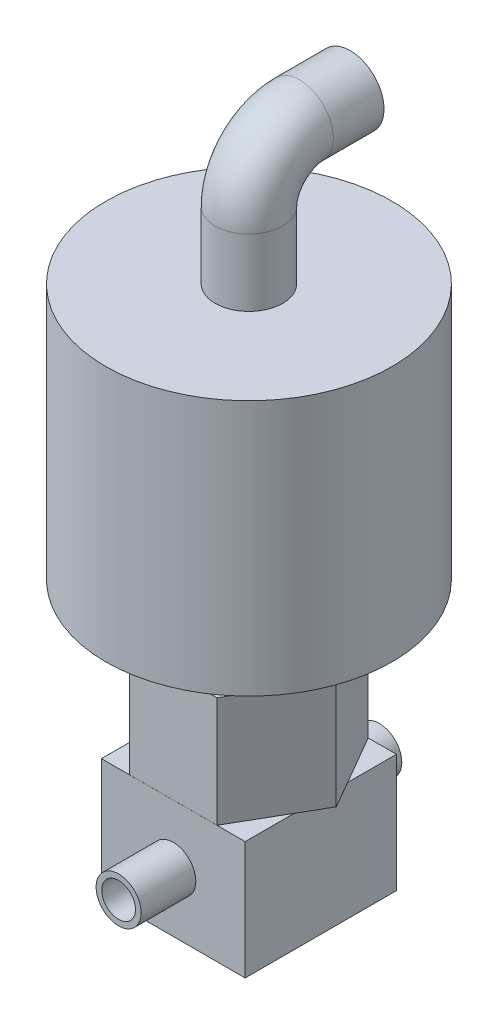
ISO-10303-21;
HEADER;
FILE_DESCRIPTION(('STEP AP214'),'2;1');
FILE_NAME('part.step','',(''),(''),'','','');
FILE_SCHEMA(('AUTOMOTIVE_DESIGN { 1 0 10303 214 1 1 1 1 }'));
ENDSEC;
DATA;
#1=APPLICATION_CONTEXT('core data for automotive mechanical design processes');
#2=APPLICATION_PROTOCOL_DEFINITION('international standard','automotive_design',2000,#1);
#3=PRODUCT_CONTEXT('',#1,'mechanical');
#4=PRODUCT('Part','Part','',(#3));
#5=PRODUCT_RELATED_PRODUCT_CATEGORY('part','',(#4));
#6=PRODUCT_DEFINITION_FORMATION('','',#4);
#7=PRODUCT_DEFINITION_CONTEXT('part definition',#1,'design');
#8=PRODUCT_DEFINITION('design','',#6,#7);
#9=PRODUCT_DEFINITION_SHAPE('','',#8);
#10=(LENGTH_UNIT() NAMED_UNIT(*) SI_UNIT(.MILLI.,.METRE.));
#11=(NAMED_UNIT(*) PLANE_ANGLE_UNIT() SI_UNIT($,.RADIAN.));
#12=(NAMED_UNIT(*) SI_UNIT($,.STERADIAN.) SOLID_ANGLE_UNIT());
#13=UNCERTAINTY_MEASURE_WITH_UNIT(LENGTH_MEASURE(1.E-05),#10,'distance_accuracy_value','');
#14=(GEOMETRIC_REPRESENTATION_CONTEXT(3) GLOBAL_UNCERTAINTY_ASSIGNED_CONTEXT((#13)) GLOBAL_UNIT_ASSIGNED_CONTEXT((#10,
#11,#12)) REPRESENTATION_CONTEXT('',''));
#15=CARTESIAN_POINT('',(0.,0.,0.));
#16=DIRECTION('',(0.,0.,1.));
#17=DIRECTION('',(1.,0.,0.));
#18=AXIS2_PLACEMENT_3D('',#15,#16,#17);
#19=CARTESIAN_POINT('',(0.,42.9768,-14.21765));
#20=DIRECTION('',(0.,-1.,0.));
#21=DIRECTION('',(0.,0.,-1.));
#22=AXIS2_PLACEMENT_3D('',#19,#20,#21);
#23=PLANE('',#22);
#24=CARTESIAN_POINT('',(0.,42.9768,0.));
#25=DIRECTION('',(0.,1.,0.));
#26=DIRECTION('',(0.,0.,1.));
#27=AXIS2_PLACEMENT_3D('',#24,#25,#26);
#28=CIRCLE('',#27,9.4234);
#29=CARTESIAN_POINT('',(0.,42.9768,9.4234));
#30=VERTEX_POINT('',#29);
#31=EDGE_CURVE('E155',#30,#30,#28,.T.);
#32=ORIENTED_EDGE('',*,*,#31,.F.);
#33=EDGE_LOOP('',(#32));
#34=FACE_BOUND('',#33,.T.);
#35=DIRECTION('',(0.5,0.,0.866025403784439));
#36=VECTOR('',#35,1.);
#37=CARTESIAN_POINT('',(-8.20856405474388,42.9768,14.21765));
#38=LINE('',#37,#36);
#39=CARTESIAN_POINT('',(-16.4171281094878,42.9768,0.));
#40=VERTEX_POINT('',#39);
#41=CARTESIAN_POINT('',(-8.20856405474388,42.9768,14.21765));
#42=VERTEX_POINT('',#41);
#43=EDGE_CURVE('E215',#40,#42,#38,.T.);
#44=ORIENTED_EDGE('',*,*,#43,.T.);
#45=DIRECTION('',(1.,0.,0.));
#46=VECTOR('',#45,1.);
#47=CARTESIAN_POINT('',(8.20856405474388,42.9768,14.21765));
#48=LINE('',#47,#46);
#49=CARTESIAN_POINT('',(8.20856405474388,42.9768,14.21765));
#50=VERTEX_POINT('',#49);
#51=EDGE_CURVE('E211',#42,#50,#48,.T.);
#52=ORIENTED_EDGE('',*,*,#51,.T.);
#53=DIRECTION('',(0.5,0.,-0.866025403784439));
#54=VECTOR('',#53,1.);
#55=CARTESIAN_POINT('',(16.4171281094878,42.9768,0.));
#56=LINE('',#55,#54);
#57=CARTESIAN_POINT('',(16.4171281094878,42.9768,0.));
#58=VERTEX_POINT('',#57);
#59=EDGE_CURVE('E117',#50,#58,#56,.T.);
#60=ORIENTED_EDGE('',*,*,#59,.T.);
#61=DIRECTION('',(-0.5,0.,-0.866025403784439));
#62=VECTOR('',#61,1.);
#63=CARTESIAN_POINT('',(8.20856405474386,42.9768,-14.21765));
#64=LINE('',#63,#62);
#65=CARTESIAN_POINT('',(8.20856405474386,42.9768,-14.21765));
#66=VERTEX_POINT('',#65);
#67=EDGE_CURVE('E228',#58,#66,#64,.T.);
#68=ORIENTED_EDGE('',*,*,#67,.T.);
#69=DIRECTION('',(-1.,0.,0.));
#70=VECTOR('',#69,1.);
#71=CARTESIAN_POINT('',(-8.2085640547439,42.9768,-14.21765));
#72=LINE('',#71,#70);
#73=CARTESIAN_POINT('',(-8.2085640547439,42.9768,-14.21765));
#74=VERTEX_POINT('',#73);
#75=EDGE_CURVE('E224',#66,#74,#72,.T.);
#76=ORIENTED_EDGE('',*,*,#75,.T.);
#77=DIRECTION('',(-0.499999999999999,0.,0.866025403784439));
#78=VECTOR('',#77,1.);
#79=CARTESIAN_POINT('',(-16.4171281094878,42.9768,0.));
#80=LINE('',#79,#78);
#81=EDGE_CURVE('E220',#74,#40,#80,.T.);
#82=ORIENTED_EDGE('',*,*,#81,.T.);
#83=EDGE_LOOP('',(#44,#52,#60,#68,#76,#82));
#84=FACE_BOUND('',#83,.T.);
#85=ADVANCED_FACE('F39',(#34,#84),#23,.F.);
#86=CARTESIAN_POINT('',(0.,0.,0.));
#87=DIRECTION('',(0.,1.,0.));
#88=DIRECTION('',(0.,0.,1.));
#89=AXIS2_PLACEMENT_3D('',#86,#87,#88);
#90=CYLINDRICAL_SURFACE('',#89,9.4234);
#91=CARTESIAN_POINT('',(0.,51.0667,0.));
#92=DIRECTION('',(0.,1.,0.));
#93=DIRECTION('',(0.,0.,1.));
#94=AXIS2_PLACEMENT_3D('',#91,#92,#93);
#95=CIRCLE('',#94,9.4234);
#96=CARTESIAN_POINT('',(0.,51.0667,9.4234));
#97=VERTEX_POINT('',#96);
#98=EDGE_CURVE('E151',#97,#97,#95,.T.);
#99=ORIENTED_EDGE('',*,*,#98,.F.);
#100=EDGE_LOOP('',(#99));
#101=FACE_BOUND('',#100,.T.);
#102=ORIENTED_EDGE('',*,*,#31,.T.);
#103=EDGE_LOOP('',(#102));
#104=FACE_BOUND('',#103,.T.);
#105=ADVANCED_FACE('F301',(#101,#104),#90,.T.);
#106=CARTESIAN_POINT('',(0.,51.0667,-9.4234));
#107=DIRECTION('',(0.,1.,0.));
#108=DIRECTION('',(0.,0.,1.));
#109=AXIS2_PLACEMENT_3D('',#106,#107,#108);
#110=PLANE('',#109);
#111=CARTESIAN_POINT('',(0.,51.0667,0.));
#112=DIRECTION('',(0.,1.,0.));
#113=DIRECTION('',(0.,0.,1.));
#114=AXIS2_PLACEMENT_3D('',#111,#112,#113);
#115=CIRCLE('',#114,26.924);
#116=CARTESIAN_POINT('',(0.,51.0667,26.924));
#117=VERTEX_POINT('',#116);
#118=EDGE_CURVE('E147',#117,#117,#115,.T.);
#119=ORIENTED_EDGE('',*,*,#118,.F.);
#120=EDGE_LOOP('',(#119));
#121=FACE_BOUND('',#120,.T.);
#122=ORIENTED_EDGE('',*,*,#98,.T.);
#123=EDGE_LOOP('',(#122));
#124=FACE_BOUND('',#123,.T.);
#125=ADVANCED_FACE('F307',(#121,#124),#110,.F.);
#126=CARTESIAN_POINT('',(0.,0.,0.));
#127=DIRECTION('',(0.,1.,0.));
#128=DIRECTION('',(0.,0.,1.));
#129=AXIS2_PLACEMENT_3D('',#126,#127,#128);
#130=CYLINDRICAL_SURFACE('',#129,26.924);
#131=CARTESIAN_POINT('',(0.,99.1743,0.));
#132=DIRECTION('',(0.,1.,0.));
#133=DIRECTION('',(0.,0.,1.));
#134=AXIS2_PLACEMENT_3D('',#131,#132,#133);
#135=CIRCLE('',#134,26.924);
#136=CARTESIAN_POINT('',(0.,99.1743,26.924));
#137=VERTEX_POINT('',#136);
#138=EDGE_CURVE('E143',#137,#137,#135,.T.);
#139=ORIENTED_EDGE('',*,*,#138,.F.);
#140=EDGE_LOOP('',(#139));
#141=FACE_BOUND('',#140,.T.);
#142=ORIENTED_EDGE('',*,*,#118,.T.);
#143=EDGE_LOOP('',(#142));
#144=FACE_BOUND('',#143,.T.);
#145=ADVANCED_FACE('F493',(#141,#144),#130,.T.);
#146=CARTESIAN_POINT('',(0.,99.1743,-26.924));
#147=DIRECTION('',(0.,-1.,0.));
#148=DIRECTION('',(0.,0.,-1.));
#149=AXIS2_PLACEMENT_3D('',#146,#147,#148);
#150=PLANE('',#149);
#151=CARTESIAN_POINT('',(0.,99.1743,0.));
#152=DIRECTION('',(0.,1.,0.));
#153=DIRECTION('',(0.,0.,1.));
#154=AXIS2_PLACEMENT_3D('',#151,#152,#153);
#155=CIRCLE('',#154,6.35);
#156=CARTESIAN_POINT('',(0.,99.1743,6.35));
#157=VERTEX_POINT('',#156);
#158=EDGE_CURVE('E50',#157,#157,#155,.T.);
#159=ORIENTED_EDGE('',*,*,#158,.F.);
#160=EDGE_LOOP('',(#159));
#161=FACE_BOUND('',#160,.T.);
#162=ORIENTED_EDGE('',*,*,#138,.T.);
#163=EDGE_LOOP('',(#162));
#164=FACE_BOUND('',#163,.T.);
#165=ADVANCED_FACE('F413',(#161,#164),#150,.F.);
#166=CARTESIAN_POINT('',(8.20856405474386,86.4124382195926,-14.21765));
#167=DIRECTION('',(0.866025403784439,0.,-0.5));
#168=DIRECTION('',(-0.5,0.,-0.866025403784439));
#169=AXIS2_PLACEMENT_3D('',#166,#167,#168);
#170=PLANE('',#169);
#171=ORIENTED_EDGE('',*,*,#67,.F.);
#172=DIRECTION('',(0.,-1.,0.));
#173=VECTOR('',#172,1.);
#174=CARTESIAN_POINT('',(16.4171281094878,86.4124382195926,0.));
#175=LINE('',#174,#173);
#176=CARTESIAN_POINT('',(16.4171281094878,22.2123,0.));
#177=VERTEX_POINT('',#176);
#178=EDGE_CURVE('E258',#58,#177,#175,.T.);
#179=ORIENTED_EDGE('',*,*,#178,.T.);
#180=DIRECTION('',(0.5,0.,0.866025403784438));
#181=VECTOR('',#180,1.);
#182=CARTESIAN_POINT('',(8.20856405474386,22.2123,-14.21765));
#183=LINE('',#182,#181);
#184=CARTESIAN_POINT('',(13.5128,22.2123,-5.03044384748326));
#185=VERTEX_POINT('',#184);
#186=EDGE_CURVE('E207',#185,#177,#183,.T.);
#187=ORIENTED_EDGE('',*,*,#186,.F.);
#188=CARTESIAN_POINT('',(8.20856405474386,22.2123,-14.21765));
#189=VERTEX_POINT('',#188);
#190=EDGE_CURVE('E235',#189,#185,#183,.T.);
#191=ORIENTED_EDGE('',*,*,#190,.F.);
#192=DIRECTION('',(0.,-1.,0.));
#193=VECTOR('',#192,1.);
#194=CARTESIAN_POINT('',(8.20856405474386,86.4124382195926,-14.21765));
#195=LINE('',#194,#193);
#196=EDGE_CURVE('E216',#66,#189,#195,.T.);
#197=ORIENTED_EDGE('',*,*,#196,.F.);
#198=EDGE_LOOP('',(#171,#179,#187,#191,#197));
#199=FACE_BOUND('',#198,.T.);
#200=ADVANCED_FACE('F343',(#199),#170,.T.);
#201=CARTESIAN_POINT('',(-8.2085640547439,86.4124382195926,-14.21765));
#202=DIRECTION('',(0.,0.,-1.));
#203=DIRECTION('',(-1.,0.,0.));
#204=AXIS2_PLACEMENT_3D('',#201,#202,#203);
#205=PLANE('',#204);
#206=DIRECTION('',(0.,-1.,0.));
#207=VECTOR('',#206,1.);
#208=CARTESIAN_POINT('',(-8.2085640547439,86.4124382195926,-14.21765));
#209=LINE('',#208,#207);
#210=CARTESIAN_POINT('',(-8.2085640547439,22.2123,-14.21765));
#211=VERTEX_POINT('',#210);
#212=EDGE_CURVE('E262',#74,#211,#209,.T.);
#213=ORIENTED_EDGE('',*,*,#212,.F.);
#214=ORIENTED_EDGE('',*,*,#75,.F.);
#215=ORIENTED_EDGE('',*,*,#196,.T.);
#216=DIRECTION('',(1.,0.,0.));
#217=VECTOR('',#216,1.);
#218=CARTESIAN_POINT('',(-8.2085640547439,22.2123,-14.21765));
#219=LINE('',#218,#217);
#220=EDGE_CURVE('E254',#211,#189,#219,.T.);
#221=ORIENTED_EDGE('',*,*,#220,.F.);
#222=EDGE_LOOP('',(#213,#214,#215,#221));
#223=FACE_BOUND('',#222,.T.);
#224=ADVANCED_FACE('F405',(#223),#205,.T.);
#225=CARTESIAN_POINT('',(-16.4171281094878,86.4124382195926,0.));
#226=DIRECTION('',(-0.866025403784439,0.,-0.499999999999999));
#227=DIRECTION('',(-0.499999999999999,0.,0.866025403784439));
#228=AXIS2_PLACEMENT_3D('',#225,#226,#227);
#229=PLANE('',#228);
#230=ORIENTED_EDGE('',*,*,#81,.F.);
#231=ORIENTED_EDGE('',*,*,#212,.T.);
#232=DIRECTION('',(0.499999999999999,0.,-0.866025403784439));
#233=VECTOR('',#232,1.);
#234=CARTESIAN_POINT('',(-16.4171281094878,22.2123,0.));
#235=LINE('',#234,#233);
#236=CARTESIAN_POINT('',(-13.5128,22.2123,-5.0304438474833));
#237=VERTEX_POINT('',#236);
#238=EDGE_CURVE('E249',#237,#211,#235,.T.);
#239=ORIENTED_EDGE('',*,*,#238,.F.);
#240=CARTESIAN_POINT('',(-16.4171281094878,22.2123,0.));
#241=VERTEX_POINT('',#240);
#242=EDGE_CURVE('E250',#241,#237,#235,.T.);
#243=ORIENTED_EDGE('',*,*,#242,.F.);
#244=DIRECTION('',(0.,-1.,0.));
#245=VECTOR('',#244,1.);
#246=CARTESIAN_POINT('',(-16.4171281094878,86.4124382195926,0.));
#247=LINE('',#246,#245);
#248=EDGE_CURVE('E266',#40,#241,#247,.T.);
#249=ORIENTED_EDGE('',*,*,#248,.F.);
#250=EDGE_LOOP('',(#230,#231,#239,#243,#249));
#251=FACE_BOUND('',#250,.T.);
#252=ADVANCED_FACE('F383',(#251),#229,.T.);
#253=CARTESIAN_POINT('',(-8.20856405474388,86.4124382195926,14.21765));
#254=DIRECTION('',(-0.866025403784439,0.,0.5));
#255=DIRECTION('',(0.5,0.,0.866025403784439));
#256=AXIS2_PLACEMENT_3D('',#253,#254,#255);
#257=PLANE('',#256);
#258=ORIENTED_EDGE('',*,*,#43,.F.);
#259=ORIENTED_EDGE('',*,*,#248,.T.);
#260=DIRECTION('',(-0.5,0.,-0.866025403784438));
#261=VECTOR('',#260,1.);
#262=CARTESIAN_POINT('',(-8.20856405474388,22.2123,14.21765));
#263=LINE('',#262,#261);
#264=CARTESIAN_POINT('',(-13.5128,22.2123,5.0304438474833));
#265=VERTEX_POINT('',#264);
#266=EDGE_CURVE('E245',#265,#241,#263,.T.);
#267=ORIENTED_EDGE('',*,*,#266,.F.);
#268=CARTESIAN_POINT('',(-8.20856405474388,22.2123,14.21765));
#269=VERTEX_POINT('',#268);
#270=EDGE_CURVE('E246',#269,#265,#263,.T.);
#271=ORIENTED_EDGE('',*,*,#270,.F.);
#272=DIRECTION('',(0.,-1.,0.));
#273=VECTOR('',#272,1.);
#274=CARTESIAN_POINT('',(-8.20856405474388,86.4124382195926,14.21765));
#275=LINE('',#274,#273);
#276=EDGE_CURVE('E270',#42,#269,#275,.T.);
#277=ORIENTED_EDGE('',*,*,#276,.F.);
#278=EDGE_LOOP('',(#258,#259,#267,#271,#277));
#279=FACE_BOUND('',#278,.T.);
#280=ADVANCED_FACE('F372',(#279),#257,.T.);
#281=CARTESIAN_POINT('',(8.20856405474388,86.4124382195926,14.21765));
#282=DIRECTION('',(0.,0.,1.));
#283=DIRECTION('',(1.,0.,0.));
#284=AXIS2_PLACEMENT_3D('',#281,#282,#283);
#285=PLANE('',#284);
#286=ORIENTED_EDGE('',*,*,#51,.F.);
#287=ORIENTED_EDGE('',*,*,#276,.T.);
#288=DIRECTION('',(-1.,0.,0.));
#289=VECTOR('',#288,1.);
#290=CARTESIAN_POINT('',(8.20856405474388,22.2123,14.21765));
#291=LINE('',#290,#289);
#292=CARTESIAN_POINT('',(8.20856405474388,22.2123,14.21765));
#293=VERTEX_POINT('',#292);
#294=EDGE_CURVE('E240',#293,#269,#291,.T.);
#295=ORIENTED_EDGE('',*,*,#294,.F.);
#296=DIRECTION('',(0.,-1.,0.));
#297=VECTOR('',#296,1.);
#298=CARTESIAN_POINT('',(8.20856405474388,86.4124382195926,14.21765));
#299=LINE('',#298,#297);
#300=EDGE_CURVE('E274',#50,#293,#299,.T.);
#301=ORIENTED_EDGE('',*,*,#300,.F.);
#302=EDGE_LOOP('',(#286,#287,#295,#301));
#303=FACE_BOUND('',#302,.T.);
#304=ADVANCED_FACE('F364',(#303),#285,.T.);
#305=CARTESIAN_POINT('',(16.4171281094878,86.4124382195926,0.));
#306=DIRECTION('',(0.866025403784439,0.,0.5));
#307=DIRECTION('',(0.5,0.,-0.866025403784439));
#308=AXIS2_PLACEMENT_3D('',#305,#306,#307);
#309=PLANE('',#308);
#310=ORIENTED_EDGE('',*,*,#59,.F.);
#311=ORIENTED_EDGE('',*,*,#300,.T.);
#312=DIRECTION('',(-0.5,0.,0.866025403784439));
#313=VECTOR('',#312,1.);
#314=CARTESIAN_POINT('',(16.4171281094878,22.2123,0.));
#315=LINE('',#314,#313);
#316=CARTESIAN_POINT('',(13.5128,22.2123,5.03044384748327));
#317=VERTEX_POINT('',#316);
#318=EDGE_CURVE('E241',#317,#293,#315,.T.);
#319=ORIENTED_EDGE('',*,*,#318,.F.);
#320=EDGE_CURVE('E236',#177,#317,#315,.T.);
#321=ORIENTED_EDGE('',*,*,#320,.F.);
#322=ORIENTED_EDGE('',*,*,#178,.F.);
#323=EDGE_LOOP('',(#310,#311,#319,#321,#322));
#324=FACE_BOUND('',#323,.T.);
#325=ADVANCED_FACE('F360',(#324),#309,.T.);
#326=CARTESIAN_POINT('',(0.,0.,0.));
#327=DIRECTION('',(0.,1.,0.));
#328=DIRECTION('',(0.,0.,1.));
#329=AXIS2_PLACEMENT_3D('',#326,#327,#328);
#330=PLANE('',#329);
#331=CARTESIAN_POINT('',(-8.29600707087452,0.,-9.60755));
#332=DIRECTION('',(0.,-1.,0.));
#333=DIRECTION('',(0.,0.,-1.));
#334=AXIS2_PLACEMENT_3D('',#331,#332,#333);
#335=CIRCLE('',#334,2.05105);
#336=CARTESIAN_POINT('',(-8.29600707087452,0.,-11.6586));
#337=VERTEX_POINT('',#336);
#338=EDGE_CURVE('E434',#337,#337,#335,.T.);
#339=ORIENTED_EDGE('',*,*,#338,.F.);
#340=EDGE_LOOP('',(#339));
#341=FACE_BOUND('',#340,.T.);
#342=CARTESIAN_POINT('',(8.29600707087451,0.,9.60755));
#343=DIRECTION('',(0.,-1.,0.));
#344=DIRECTION('',(0.,0.,-1.));
#345=AXIS2_PLACEMENT_3D('',#342,#343,#344);
#346=CIRCLE('',#345,2.05105);
#347=CARTESIAN_POINT('',(8.29600707087451,0.,7.5565));
#348=VERTEX_POINT('',#347);
#349=EDGE_CURVE('E437',#348,#348,#346,.T.);
#350=ORIENTED_EDGE('',*,*,#349,.F.);
#351=EDGE_LOOP('',(#350));
#352=FACE_BOUND('',#351,.T.);
#353=DIRECTION('',(0.,0.,1.));
#354=VECTOR('',#353,1.);
#355=CARTESIAN_POINT('',(13.5128,0.,-14.224));
#356=LINE('',#355,#354);
#357=CARTESIAN_POINT('',(13.5128,0.,-14.224));
#358=VERTEX_POINT('',#357);
#359=CARTESIAN_POINT('',(13.5128,0.,14.224));
#360=VERTEX_POINT('',#359);
#361=EDGE_CURVE('E113',#358,#360,#356,.T.);
#362=ORIENTED_EDGE('',*,*,#361,.T.);
#363=DIRECTION('',(-1.,0.,0.));
#364=VECTOR('',#363,1.);
#365=CARTESIAN_POINT('',(-13.5128,0.,14.224));
#366=LINE('',#365,#364);
#367=CARTESIAN_POINT('',(-13.5128,0.,14.224));
#368=VERTEX_POINT('',#367);
#369=EDGE_CURVE('E100',#360,#368,#366,.T.);
#370=ORIENTED_EDGE('',*,*,#369,.T.);
#371=DIRECTION('',(0.,0.,-1.));
#372=VECTOR('',#371,1.);
#373=CARTESIAN_POINT('',(-13.5128,0.,-14.224));
#374=LINE('',#373,#372);
#375=CARTESIAN_POINT('',(-13.5128,0.,-14.224));
#376=VERTEX_POINT('',#375);
#377=EDGE_CURVE('E105',#368,#376,#374,.T.);
#378=ORIENTED_EDGE('',*,*,#377,.T.);
#379=DIRECTION('',(1.,0.,0.));
#380=VECTOR('',#379,1.);
#381=CARTESIAN_POINT('',(-13.5128,0.,-14.224));
#382=LINE('',#381,#380);
#383=EDGE_CURVE('E111',#376,#358,#382,.T.);
#384=ORIENTED_EDGE('',*,*,#383,.T.);
#385=EDGE_LOOP('',(#362,#370,#378,#384));
#386=FACE_BOUND('',#385,.T.);
#387=ADVANCED_FACE('F41',(#341,#352,#386),#330,.F.);
#388=CARTESIAN_POINT('',(-13.5128,61.4509513448156,14.224));
#389=DIRECTION('',(0.,0.,1.));
#390=DIRECTION('',(1.,0.,0.));
#391=AXIS2_PLACEMENT_3D('',#388,#389,#390);
#392=PLANE('',#391);
#393=CARTESIAN_POINT('',(0.,11.10615,14.224));
#394=DIRECTION('',(0.,0.,1.));
#395=DIRECTION('',(1.,0.,0.));
#396=AXIS2_PLACEMENT_3D('',#393,#394,#395);
#397=CIRCLE('',#396,4.23333333333333);
#398=CARTESIAN_POINT('',(4.23333333333333,11.10615,14.224));
#399=VERTEX_POINT('',#398);
#400=EDGE_CURVE('E202',#399,#399,#397,.T.);
#401=ORIENTED_EDGE('',*,*,#400,.F.);
#402=EDGE_LOOP('',(#401));
#403=FACE_BOUND('',#402,.T.);
#404=DIRECTION('',(0.,-1.,0.));
#405=VECTOR('',#404,1.);
#406=CARTESIAN_POINT('',(13.5128,61.4509513448156,14.224));
#407=LINE('',#406,#405);
#408=CARTESIAN_POINT('',(13.5128,22.2123,14.224));
#409=VERTEX_POINT('',#408);
#410=EDGE_CURVE('E59',#409,#360,#407,.T.);
#411=ORIENTED_EDGE('',*,*,#410,.F.);
#412=DIRECTION('',(-1.,0.,0.));
#413=VECTOR('',#412,1.);
#414=CARTESIAN_POINT('',(-13.5128,22.2123,14.224));
#415=LINE('',#414,#413);
#416=CARTESIAN_POINT('',(-13.5128,22.2123,14.224));
#417=VERTEX_POINT('',#416);
#418=EDGE_CURVE('E102',#409,#417,#415,.T.);
#419=ORIENTED_EDGE('',*,*,#418,.T.);
#420=DIRECTION('',(0.,-1.,0.));
#421=VECTOR('',#420,1.);
#422=CARTESIAN_POINT('',(-13.5128,61.4509513448156,14.224));
#423=LINE('',#422,#421);
#424=EDGE_CURVE('E97',#417,#368,#423,.T.);
#425=ORIENTED_EDGE('',*,*,#424,.T.);
#426=ORIENTED_EDGE('',*,*,#369,.F.);
#427=EDGE_LOOP('',(#411,#419,#425,#426));
#428=FACE_BOUND('',#427,.T.);
#429=ADVANCED_FACE('F98',(#403,#428),#392,.T.);
#430=CARTESIAN_POINT('',(-13.5128,61.4509513448156,-14.224));
#431=DIRECTION('',(0.,0.,-1.));
#432=DIRECTION('',(-1.,0.,0.));
#433=AXIS2_PLACEMENT_3D('',#430,#431,#432);
#434=PLANE('',#433);
#435=CARTESIAN_POINT('',(0.,11.10615,-14.224));
#436=DIRECTION('',(0.,0.,-1.));
#437=DIRECTION('',(-1.,0.,0.));
#438=AXIS2_PLACEMENT_3D('',#435,#436,#437);
#439=CIRCLE('',#438,4.23333333333333);
#440=CARTESIAN_POINT('',(-4.23333333333333,11.10615,-14.224));
#441=VERTEX_POINT('',#440);
#442=EDGE_CURVE('E43',#441,#441,#439,.T.);
#443=ORIENTED_EDGE('',*,*,#442,.F.);
#444=EDGE_LOOP('',(#443));
#445=FACE_BOUND('',#444,.T.);
#446=DIRECTION('',(0.,-1.,0.));
#447=VECTOR('',#446,1.);
#448=CARTESIAN_POINT('',(-13.5128,61.4509513448156,-14.224));
#449=LINE('',#448,#447);
#450=CARTESIAN_POINT('',(-13.5128,22.2123,-14.224));
#451=VERTEX_POINT('',#450);
#452=EDGE_CURVE('E92',#451,#376,#449,.T.);
#453=ORIENTED_EDGE('',*,*,#452,.F.);
#454=DIRECTION('',(1.,0.,0.));
#455=VECTOR('',#454,1.);
#456=CARTESIAN_POINT('',(-13.5128,22.2123,-14.224));
#457=LINE('',#456,#455);
#458=CARTESIAN_POINT('',(13.5128,22.2123,-14.224));
#459=VERTEX_POINT('',#458);
#460=EDGE_CURVE('E129',#451,#459,#457,.T.);
#461=ORIENTED_EDGE('',*,*,#460,.T.);
#462=DIRECTION('',(0.,-1.,0.));
#463=VECTOR('',#462,1.);
#464=CARTESIAN_POINT('',(13.5128,61.4509513448156,-14.224));
#465=LINE('',#464,#463);
#466=EDGE_CURVE('E133',#459,#358,#465,.T.);
#467=ORIENTED_EDGE('',*,*,#466,.T.);
#468=ORIENTED_EDGE('',*,*,#383,.F.);
#469=EDGE_LOOP('',(#453,#461,#467,#468));
#470=FACE_BOUND('',#469,.T.);
#471=ADVANCED_FACE('F285',(#445,#470),#434,.T.);
#472=CARTESIAN_POINT('',(13.5128,61.4509513448156,-14.224));
#473=DIRECTION('',(1.,0.,0.));
#474=DIRECTION('',(0.,0.,-1.));
#475=AXIS2_PLACEMENT_3D('',#472,#473,#474);
#476=PLANE('',#475);
#477=ORIENTED_EDGE('',*,*,#466,.F.);
#478=DIRECTION('',(0.,0.,1.));
#479=VECTOR('',#478,1.);
#480=CARTESIAN_POINT('',(13.5128,22.2123,-14.224));
#481=LINE('',#480,#479);
#482=EDGE_CURVE('E123',#459,#185,#481,.T.);
#483=ORIENTED_EDGE('',*,*,#482,.T.);
#484=EDGE_CURVE('E127',#185,#317,#481,.T.);
#485=ORIENTED_EDGE('',*,*,#484,.T.);
#486=EDGE_CURVE('E128',#317,#409,#481,.T.);
#487=ORIENTED_EDGE('',*,*,#486,.T.);
#488=ORIENTED_EDGE('',*,*,#410,.T.);
#489=ORIENTED_EDGE('',*,*,#361,.F.);
#490=EDGE_LOOP('',(#477,#483,#485,#487,#488,#489));
#491=FACE_BOUND('',#490,.T.);
#492=ADVANCED_FACE('F287',(#491),#476,.T.);
#493=CARTESIAN_POINT('',(-13.5128,61.4509513448156,-14.224));
#494=DIRECTION('',(-1.,0.,0.));
#495=DIRECTION('',(0.,0.,1.));
#496=AXIS2_PLACEMENT_3D('',#493,#494,#495);
#497=PLANE('',#496);
#498=ORIENTED_EDGE('',*,*,#424,.F.);
#499=DIRECTION('',(0.,0.,-1.));
#500=VECTOR('',#499,1.);
#501=CARTESIAN_POINT('',(-13.5128,22.2123,-14.224));
#502=LINE('',#501,#500);
#503=EDGE_CURVE('E86',#417,#265,#502,.T.);
#504=ORIENTED_EDGE('',*,*,#503,.T.);
#505=EDGE_CURVE('E136',#265,#237,#502,.T.);
#506=ORIENTED_EDGE('',*,*,#505,.T.);
#507=EDGE_CURVE('E78',#237,#451,#502,.T.);
#508=ORIENTED_EDGE('',*,*,#507,.T.);
#509=ORIENTED_EDGE('',*,*,#452,.T.);
#510=ORIENTED_EDGE('',*,*,#377,.F.);
#511=EDGE_LOOP('',(#498,#504,#506,#508,#509,#510));
#512=FACE_BOUND('',#511,.T.);
#513=ADVANCED_FACE('F106',(#512),#497,.T.);
#514=CARTESIAN_POINT('',(0.,22.2123,-12.7));
#515=DIRECTION('',(0.,1.,0.));
#516=DIRECTION('',(0.,0.,1.));
#517=AXIS2_PLACEMENT_3D('',#514,#515,#516);
#518=PLANE('',#517);
#519=ORIENTED_EDGE('',*,*,#270,.T.);
#520=ORIENTED_EDGE('',*,*,#503,.F.);
#521=ORIENTED_EDGE('',*,*,#418,.F.);
#522=ORIENTED_EDGE('',*,*,#486,.F.);
#523=ORIENTED_EDGE('',*,*,#318,.T.);
#524=ORIENTED_EDGE('',*,*,#294,.T.);
#525=EDGE_LOOP('',(#519,#520,#521,#522,#523,#524));
#526=FACE_BOUND('',#525,.T.);
#527=ADVANCED_FACE('F294',(#526),#518,.T.);
#528=ORIENTED_EDGE('',*,*,#190,.T.);
#529=ORIENTED_EDGE('',*,*,#482,.F.);
#530=ORIENTED_EDGE('',*,*,#460,.F.);
#531=ORIENTED_EDGE('',*,*,#507,.F.);
#532=ORIENTED_EDGE('',*,*,#238,.T.);
#533=ORIENTED_EDGE('',*,*,#220,.T.);
#534=EDGE_LOOP('',(#528,#529,#530,#531,#532,#533));
#535=FACE_BOUND('',#534,.T.);
#536=ADVANCED_FACE('F325',(#535),#518,.T.);
#537=CARTESIAN_POINT('',(0.,22.2123,-12.7));
#538=DIRECTION('',(0.,1.,0.));
#539=DIRECTION('',(0.,0.,1.));
#540=AXIS2_PLACEMENT_3D('',#537,#538,#539);
#541=PLANE('',#540);
#542=ORIENTED_EDGE('',*,*,#505,.F.);
#543=ORIENTED_EDGE('',*,*,#266,.T.);
#544=ORIENTED_EDGE('',*,*,#242,.T.);
#545=EDGE_LOOP('',(#542,#543,#544));
#546=FACE_BOUND('',#545,.T.);
#547=ADVANCED_FACE('F316',(#546),#541,.F.);
#548=ORIENTED_EDGE('',*,*,#484,.F.);
#549=ORIENTED_EDGE('',*,*,#186,.T.);
#550=ORIENTED_EDGE('',*,*,#320,.T.);
#551=EDGE_LOOP('',(#548,#549,#550));
#552=FACE_BOUND('',#551,.T.);
#553=ADVANCED_FACE('F313',(#552),#541,.F.);
#554=CARTESIAN_POINT('',(0.,11.10615,24.511));
#555=DIRECTION('',(0.,0.,1.));
#556=DIRECTION('',(1.,0.,0.));
#557=AXIS2_PLACEMENT_3D('',#554,#555,#556);
#558=PLANE('',#557);
#559=CARTESIAN_POINT('',(0.,11.10615,24.511));
#560=DIRECTION('',(0.,0.,1.));
#561=DIRECTION('',(1.,0.,0.));
#562=AXIS2_PLACEMENT_3D('',#559,#560,#561);
#563=CIRCLE('',#562,4.23333333333333);
#564=CARTESIAN_POINT('',(4.23333333333333,11.10615,24.511));
#565=VERTEX_POINT('',#564);
#566=EDGE_CURVE('E203',#565,#565,#563,.T.);
#567=ORIENTED_EDGE('',*,*,#566,.T.);
#568=EDGE_LOOP('',(#567));
#569=FACE_BOUND('',#568,.T.);
#570=CARTESIAN_POINT('',(0.,11.10615,24.511));
#571=DIRECTION('',(0.,0.,1.));
#572=DIRECTION('',(1.,0.,0.));
#573=AXIS2_PLACEMENT_3D('',#570,#571,#572);
#574=CIRCLE('',#573,3.175);
#575=CARTESIAN_POINT('',(3.175,11.10615,24.511));
#576=VERTEX_POINT('',#575);
#577=EDGE_CURVE('E198',#576,#576,#574,.T.);
#578=ORIENTED_EDGE('',*,*,#577,.F.);
#579=EDGE_LOOP('',(#578));
#580=FACE_BOUND('',#579,.T.);
#581=ADVANCED_FACE('F315',(#569,#580),#558,.T.);
#582=CARTESIAN_POINT('',(0.,11.10615,24.511));
#583=DIRECTION('',(0.,0.,-1.));
#584=DIRECTION('',(-1.,0.,0.));
#585=AXIS2_PLACEMENT_3D('',#582,#583,#584);
#586=CYLINDRICAL_SURFACE('',#585,4.23333333333333);
#587=ORIENTED_EDGE('',*,*,#566,.F.);
#588=EDGE_LOOP('',(#587));
#589=FACE_BOUND('',#588,.T.);
#590=ORIENTED_EDGE('',*,*,#400,.T.);
#591=EDGE_LOOP('',(#590));
#592=FACE_BOUND('',#591,.T.);
#593=ADVANCED_FACE('F322',(#589,#592),#586,.T.);
#594=CARTESIAN_POINT('',(0.,11.10615,24.511));
#595=DIRECTION('',(0.,0.,-1.));
#596=DIRECTION('',(-1.,0.,0.));
#597=AXIS2_PLACEMENT_3D('',#594,#595,#596);
#598=CYLINDRICAL_SURFACE('',#597,3.175);
#599=ORIENTED_EDGE('',*,*,#577,.T.);
#600=EDGE_LOOP('',(#599));
#601=FACE_BOUND('',#600,.T.);
#602=CARTESIAN_POINT('',(0.,11.10615,14.224));
#603=DIRECTION('',(0.,0.,1.));
#604=DIRECTION('',(1.,0.,0.));
#605=AXIS2_PLACEMENT_3D('',#602,#603,#604);
#606=CIRCLE('',#605,3.175);
#607=CARTESIAN_POINT('',(3.175,11.10615,14.224));
#608=VERTEX_POINT('',#607);
#609=EDGE_CURVE('E158',#608,#608,#606,.F.);
#610=ORIENTED_EDGE('',*,*,#609,.T.);
#611=EDGE_LOOP('',(#610));
#612=FACE_BOUND('',#611,.T.);
#613=ADVANCED_FACE('F525',(#601,#612),#598,.F.);
#614=ORIENTED_EDGE('',*,*,#609,.F.);
#615=EDGE_LOOP('',(#614));
#616=FACE_BOUND('',#615,.T.);
#617=ADVANCED_FACE('F430',(#616),#392,.T.);
#618=CARTESIAN_POINT('',(0.,11.10615,-24.511));
#619=DIRECTION('',(0.,0.,1.));
#620=DIRECTION('',(1.,0.,0.));
#621=AXIS2_PLACEMENT_3D('',#618,#619,#620);
#622=CYLINDRICAL_SURFACE('',#621,4.23333333333333);
#623=CARTESIAN_POINT('',(0.,11.10615,-24.511));
#624=DIRECTION('',(0.,0.,1.));
#625=DIRECTION('',(1.,0.,0.));
#626=AXIS2_PLACEMENT_3D('',#623,#624,#625);
#627=CIRCLE('',#626,4.23333333333333);
#628=CARTESIAN_POINT('',(4.23333333333333,11.10615,-24.511));
#629=VERTEX_POINT('',#628);
#630=EDGE_CURVE('E189',#629,#629,#627,.T.);
#631=ORIENTED_EDGE('',*,*,#630,.T.);
#632=EDGE_LOOP('',(#631));
#633=FACE_BOUND('',#632,.T.);
#634=ORIENTED_EDGE('',*,*,#442,.T.);
#635=EDGE_LOOP('',(#634));
#636=FACE_BOUND('',#635,.T.);
#637=ADVANCED_FACE('F520',(#633,#636),#622,.T.);
#638=CARTESIAN_POINT('',(0.,11.10615,-24.511));
#639=DIRECTION('',(0.,0.,-1.));
#640=DIRECTION('',(1.,0.,0.));
#641=AXIS2_PLACEMENT_3D('',#638,#639,#640);
#642=PLANE('',#641);
#643=CARTESIAN_POINT('',(0.,11.10615,-24.511));
#644=DIRECTION('',(0.,0.,1.));
#645=DIRECTION('',(1.,0.,0.));
#646=AXIS2_PLACEMENT_3D('',#643,#644,#645);
#647=CIRCLE('',#646,3.175);
#648=CARTESIAN_POINT('',(3.175,11.10615,-24.511));
#649=VERTEX_POINT('',#648);
#650=EDGE_CURVE('E185',#649,#649,#647,.T.);
#651=ORIENTED_EDGE('',*,*,#650,.T.);
#652=EDGE_LOOP('',(#651));
#653=FACE_BOUND('',#652,.T.);
#654=ORIENTED_EDGE('',*,*,#630,.F.);
#655=EDGE_LOOP('',(#654));
#656=FACE_BOUND('',#655,.T.);
#657=ADVANCED_FACE('F516',(#653,#656),#642,.T.);
#658=CARTESIAN_POINT('',(0.,11.10615,-24.511));
#659=DIRECTION('',(0.,0.,1.));
#660=DIRECTION('',(1.,0.,0.));
#661=AXIS2_PLACEMENT_3D('',#658,#659,#660);
#662=CYLINDRICAL_SURFACE('',#661,3.175);
#663=ORIENTED_EDGE('',*,*,#650,.F.);
#664=EDGE_LOOP('',(#663));
#665=FACE_BOUND('',#664,.T.);
#666=CARTESIAN_POINT('',(0.,11.10615,-14.224));
#667=DIRECTION('',(0.,0.,1.));
#668=DIRECTION('',(1.,0.,0.));
#669=AXIS2_PLACEMENT_3D('',#666,#667,#668);
#670=CIRCLE('',#669,3.175);
#671=CARTESIAN_POINT('',(3.175,11.10615,-14.224));
#672=VERTEX_POINT('',#671);
#673=EDGE_CURVE('E190',#672,#672,#670,.T.);
#674=ORIENTED_EDGE('',*,*,#673,.T.);
#675=EDGE_LOOP('',(#674));
#676=FACE_BOUND('',#675,.T.);
#677=ADVANCED_FACE('F506',(#665,#676),#662,.F.);
#678=ORIENTED_EDGE('',*,*,#673,.F.);
#679=EDGE_LOOP('',(#678));
#680=FACE_BOUND('',#679,.T.);
#681=ADVANCED_FACE('F298',(#680),#434,.T.);
#682=CARTESIAN_POINT('',(0.,99.1743,0.));
#683=DIRECTION('',(0.,1.,0.));
#684=DIRECTION('',(0.,0.,1.));
#685=AXIS2_PLACEMENT_3D('',#682,#683,#684);
#686=CYLINDRICAL_SURFACE('',#685,6.35);
#687=CARTESIAN_POINT('',(0.,111.76762,0.));
#688=DIRECTION('',(0.,1.,0.));
#689=DIRECTION('',(0.,0.,1.));
#690=AXIS2_PLACEMENT_3D('',#687,#688,#689);
#691=CIRCLE('',#690,6.35);
#692=CARTESIAN_POINT('',(0.,111.76762,6.34999999999999));
#693=VERTEX_POINT('',#692);
#694=EDGE_CURVE('E176',#693,#693,#691,.T.);
#695=ORIENTED_EDGE('',*,*,#694,.F.);
#696=EDGE_LOOP('',(#695));
#697=FACE_BOUND('',#696,.T.);
#698=ORIENTED_EDGE('',*,*,#158,.T.);
#699=EDGE_LOOP('',(#698));
#700=FACE_BOUND('',#699,.T.);
#701=ADVANCED_FACE('F483',(#697,#700),#686,.T.);
#702=CARTESIAN_POINT('',(0.,111.76762,-9.525));
#703=DIRECTION('',(-1.,0.,0.));
#704=DIRECTION('',(0.,0.,1.));
#705=AXIS2_PLACEMENT_3D('',#702,#703,#704);
#706=TOROIDAL_SURFACE('',#705,9.525,6.35);
#707=CARTESIAN_POINT('',(0.,121.29262,-9.52500000000001));
#708=DIRECTION('',(0.,0.,-1.));
#709=DIRECTION('',(0.,1.,0.));
#710=AXIS2_PLACEMENT_3D('',#707,#708,#709);
#711=CIRCLE('',#710,6.35);
#712=CARTESIAN_POINT('',(0.,127.64262,-9.52500000000001));
#713=VERTEX_POINT('',#712);
#714=EDGE_CURVE('E180',#713,#713,#711,.T.);
#715=CARTESIAN_POINT('',(0.,111.76762,-9.525));
#716=DIRECTION('',(-1.,0.,0.));
#717=DIRECTION('',(0.,0.,1.));
#718=AXIS2_PLACEMENT_3D('',#715,#716,#717);
#719=CIRCLE('',#718,15.875);
#720=EDGE_CURVE('',#693,#713,#719,.T.);
#721=ORIENTED_EDGE('',*,*,#694,.T.);
#722=ORIENTED_EDGE('',*,*,#714,.F.);
#723=ORIENTED_EDGE('',*,*,#720,.T.);
#724=ORIENTED_EDGE('',*,*,#720,.F.);
#725=EDGE_LOOP('',(#721,#723,#722,#724));
#726=FACE_BOUND('',#725,.T.);
#727=ADVANCED_FACE('F496',(#726),#706,.T.);
#728=CARTESIAN_POINT('',(0.,121.29262,-9.52500000000001));
#729=DIRECTION('',(0.,0.,-1.));
#730=DIRECTION('',(0.,1.,0.));
#731=AXIS2_PLACEMENT_3D('',#728,#729,#730);
#732=CYLINDRICAL_SURFACE('',#731,6.35);
#733=CARTESIAN_POINT('',(0.,121.29262,-19.05));
#734=DIRECTION('',(0.,0.,-1.));
#735=DIRECTION('',(0.,1.,0.));
#736=AXIS2_PLACEMENT_3D('',#733,#734,#735);
#737=CIRCLE('',#736,6.35);
#738=CARTESIAN_POINT('',(0.,127.64262,-19.05));
#739=VERTEX_POINT('',#738);
#740=EDGE_CURVE('E174',#739,#739,#737,.T.);
#741=ORIENTED_EDGE('',*,*,#740,.F.);
#742=EDGE_LOOP('',(#741));
#743=FACE_BOUND('',#742,.T.);
#744=ORIENTED_EDGE('',*,*,#714,.T.);
#745=EDGE_LOOP('',(#744));
#746=FACE_BOUND('',#745,.T.);
#747=ADVANCED_FACE('F503',(#743,#746),#732,.T.);
#748=CARTESIAN_POINT('',(0.,121.29262,-19.05));
#749=DIRECTION('',(0.,0.,-1.));
#750=DIRECTION('',(0.,1.,0.));
#751=AXIS2_PLACEMENT_3D('',#748,#749,#750);
#752=PLANE('',#751);
#753=CARTESIAN_POINT('',(0.,121.29262,-19.05));
#754=DIRECTION('',(0.,0.,-1.));
#755=DIRECTION('',(0.,1.,0.));
#756=AXIS2_PLACEMENT_3D('',#753,#754,#755);
#757=CIRCLE('',#756,3.175);
#758=CARTESIAN_POINT('',(0.,124.46762,-19.05));
#759=VERTEX_POINT('',#758);
#760=EDGE_CURVE('E194',#759,#759,#757,.F.);
#761=ORIENTED_EDGE('',*,*,#760,.T.);
#762=EDGE_LOOP('',(#761));
#763=FACE_BOUND('',#762,.T.);
#764=ORIENTED_EDGE('',*,*,#740,.T.);
#765=EDGE_LOOP('',(#764));
#766=FACE_BOUND('',#765,.T.);
#767=ADVANCED_FACE('F458',(#763,#766),#752,.T.);
#768=CARTESIAN_POINT('',(0.,99.1743,0.));
#769=DIRECTION('',(0.,1.,0.));
#770=DIRECTION('',(0.,0.,1.));
#771=AXIS2_PLACEMENT_3D('',#768,#769,#770);
#772=CYLINDRICAL_SURFACE('',#771,3.175);
#773=CARTESIAN_POINT('',(0.,111.76762,0.));
#774=DIRECTION('',(0.,1.,0.));
#775=DIRECTION('',(0.,0.,1.));
#776=AXIS2_PLACEMENT_3D('',#773,#774,#775);
#777=CIRCLE('',#776,3.175);
#778=CARTESIAN_POINT('',(0.,111.76762,3.17499999999999));
#779=VERTEX_POINT('',#778);
#780=EDGE_CURVE('E447',#779,#779,#777,.F.);
#781=ORIENTED_EDGE('',*,*,#780,.F.);
#782=EDGE_LOOP('',(#781));
#783=FACE_BOUND('',#782,.T.);
#784=CARTESIAN_POINT('',(0.,99.1743,0.));
#785=DIRECTION('',(0.,1.,0.));
#786=DIRECTION('',(0.,0.,1.));
#787=AXIS2_PLACEMENT_3D('',#784,#785,#786);
#788=CIRCLE('',#787,3.175);
#789=CARTESIAN_POINT('',(0.,99.1743,3.175));
#790=VERTEX_POINT('',#789);
#791=EDGE_CURVE('E11',#790,#790,#788,.F.);
#792=ORIENTED_EDGE('',*,*,#791,.T.);
#793=EDGE_LOOP('',(#792));
#794=FACE_BOUND('',#793,.T.);
#795=ADVANCED_FACE('F471',(#783,#794),#772,.F.);
#796=CARTESIAN_POINT('',(0.,111.76762,-9.525));
#797=DIRECTION('',(-1.,0.,0.));
#798=DIRECTION('',(0.,0.,1.));
#799=AXIS2_PLACEMENT_3D('',#796,#797,#798);
#800=TOROIDAL_SURFACE('',#799,9.525,3.175);
#801=CARTESIAN_POINT('',(0.,121.29262,-9.52500000000001));
#802=DIRECTION('',(0.,0.,-1.));
#803=DIRECTION('',(0.,1.,0.));
#804=AXIS2_PLACEMENT_3D('',#801,#802,#803);
#805=CIRCLE('',#804,3.175);
#806=CARTESIAN_POINT('',(0.,124.46762,-9.52500000000001));
#807=VERTEX_POINT('',#806);
#808=EDGE_CURVE('E451',#807,#807,#805,.F.);
#809=CARTESIAN_POINT('',(0.,111.76762,-9.525));
#810=DIRECTION('',(-1.,0.,0.));
#811=DIRECTION('',(0.,0.,1.));
#812=AXIS2_PLACEMENT_3D('',#809,#810,#811);
#813=CIRCLE('',#812,12.7);
#814=EDGE_CURVE('',#779,#807,#813,.T.);
#815=ORIENTED_EDGE('',*,*,#780,.T.);
#816=ORIENTED_EDGE('',*,*,#808,.F.);
#817=ORIENTED_EDGE('',*,*,#814,.T.);
#818=ORIENTED_EDGE('',*,*,#814,.F.);
#819=EDGE_LOOP('',(#815,#817,#816,#818));
#820=FACE_BOUND('',#819,.T.);
#821=ADVANCED_FACE('F465',(#820),#800,.F.);
#822=CARTESIAN_POINT('',(0.,121.29262,-9.52500000000001));
#823=DIRECTION('',(0.,0.,-1.));
#824=DIRECTION('',(0.,1.,0.));
#825=AXIS2_PLACEMENT_3D('',#822,#823,#824);
#826=CYLINDRICAL_SURFACE('',#825,3.175);
#827=ORIENTED_EDGE('',*,*,#760,.F.);
#828=EDGE_LOOP('',(#827));
#829=FACE_BOUND('',#828,.T.);
#830=ORIENTED_EDGE('',*,*,#808,.T.);
#831=EDGE_LOOP('',(#830));
#832=FACE_BOUND('',#831,.T.);
#833=ADVANCED_FACE('F461',(#829,#832),#826,.F.);
#834=ORIENTED_EDGE('',*,*,#791,.F.);
#835=EDGE_LOOP('',(#834));
#836=FACE_BOUND('',#835,.T.);
#837=ADVANCED_FACE('F464',(#836),#150,.F.);
#838=CARTESIAN_POINT('',(8.29600707087451,12.7,9.60755));
#839=DIRECTION('',(0.,-1.,0.));
#840=DIRECTION('',(0.,0.,-1.));
#841=AXIS2_PLACEMENT_3D('',#838,#839,#840);
#842=CYLINDRICAL_SURFACE('',#841,2.05105);
#843=CARTESIAN_POINT('',(8.29600707087451,12.7,9.60755));
#844=DIRECTION('',(0.,-1.,0.));
#845=DIRECTION('',(0.,0.,-1.));
#846=AXIS2_PLACEMENT_3D('',#843,#844,#845);
#847=CIRCLE('',#846,2.05105);
#848=CARTESIAN_POINT('',(8.29600707087451,12.7,7.5565));
#849=VERTEX_POINT('',#848);
#850=EDGE_CURVE('E440',#849,#849,#847,.T.);
#851=ORIENTED_EDGE('',*,*,#850,.F.);
#852=EDGE_LOOP('',(#851));
#853=FACE_BOUND('',#852,.T.);
#854=ORIENTED_EDGE('',*,*,#349,.T.);
#855=EDGE_LOOP('',(#854));
#856=FACE_BOUND('',#855,.T.);
#857=ADVANCED_FACE('F481',(#853,#856),#842,.F.);
#858=CARTESIAN_POINT('',(8.29600707087451,12.7,9.60755));
#859=DIRECTION('',(0.,-1.,0.));
#860=DIRECTION('',(0.,0.,-1.));
#861=AXIS2_PLACEMENT_3D('',#858,#859,#860);
#862=PLANE('',#861);
#863=ORIENTED_EDGE('',*,*,#850,.T.);
#864=EDGE_LOOP('',(#863));
#865=FACE_BOUND('',#864,.T.);
#866=ADVANCED_FACE('F487',(#865),#862,.T.);
#867=CARTESIAN_POINT('',(-8.29600707087452,12.7,-9.60755));
#868=DIRECTION('',(0.,-1.,0.));
#869=DIRECTION('',(0.,0.,-1.));
#870=AXIS2_PLACEMENT_3D('',#867,#868,#869);
#871=CYLINDRICAL_SURFACE('',#870,2.05105);
#872=CARTESIAN_POINT('',(-8.29600707087452,12.7,-9.60755));
#873=DIRECTION('',(0.,-1.,0.));
#874=DIRECTION('',(0.,0.,-1.));
#875=AXIS2_PLACEMENT_3D('',#872,#873,#874);
#876=CIRCLE('',#875,2.05105);
#877=CARTESIAN_POINT('',(-8.29600707087452,12.7,-11.6586));
#878=VERTEX_POINT('',#877);
#879=EDGE_CURVE('E181',#878,#878,#876,.T.);
#880=ORIENTED_EDGE('',*,*,#879,.F.);
#881=EDGE_LOOP('',(#880));
#882=FACE_BOUND('',#881,.T.);
#883=ORIENTED_EDGE('',*,*,#338,.T.);
#884=EDGE_LOOP('',(#883));
#885=FACE_BOUND('',#884,.T.);
#886=ADVANCED_FACE('F679',(#882,#885),#871,.F.);
#887=CARTESIAN_POINT('',(-8.29600707087452,12.7,-9.60755));
#888=DIRECTION('',(0.,-1.,0.));
#889=DIRECTION('',(0.,0.,-1.));
#890=AXIS2_PLACEMENT_3D('',#887,#888,#889);
#891=PLANE('',#890);
#892=ORIENTED_EDGE('',*,*,#879,.T.);
#893=EDGE_LOOP('',(#892));
#894=FACE_BOUND('',#893,.T.);
#895=ADVANCED_FACE('F689',(#894),#891,.T.);
#896=CLOSED_SHELL('',(#85,#105,#125,#145,#165,#200,#224,#252,#280,#304,#325,#387,#429,#471,#492,
#513,#527,#536,#547,#553,#581,#593,#613,#617,#637,#657,#677,#681,#701,#727,#747,#767,#795,#821,
#833,#837,#857,#866,#886,#895));
#897=MANIFOLD_SOLID_BREP('B2',#896);
#898=ADVANCED_BREP_SHAPE_REPRESENTATION('',(#18,#897),#14);
#899=SHAPE_DEFINITION_REPRESENTATION(#9,#898);
ENDSEC;
END-ISO-10303-21;
